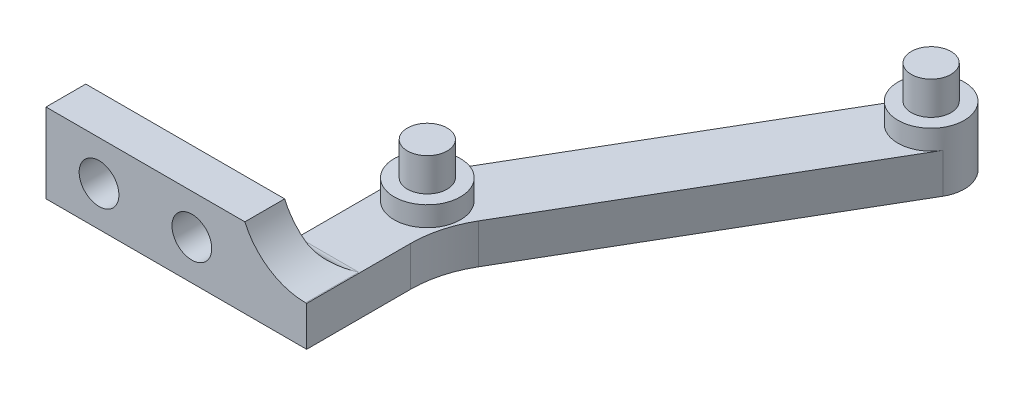
ISO-10303-21;
HEADER;
FILE_DESCRIPTION(('STEP AP214'),'2;1');
FILE_NAME('part.step','',(''),(''),'','','');
FILE_SCHEMA(('AUTOMOTIVE_DESIGN { 1 0 10303 214 1 1 1 1 }'));
ENDSEC;
DATA;
#1=APPLICATION_CONTEXT('core data for automotive mechanical design processes');
#2=APPLICATION_PROTOCOL_DEFINITION('international standard','automotive_design',2000,#1);
#3=PRODUCT_CONTEXT('',#1,'mechanical');
#4=PRODUCT('Part','Part','',(#3));
#5=PRODUCT_RELATED_PRODUCT_CATEGORY('part','',(#4));
#6=PRODUCT_DEFINITION_FORMATION('','',#4);
#7=PRODUCT_DEFINITION_CONTEXT('part definition',#1,'design');
#8=PRODUCT_DEFINITION('design','',#6,#7);
#9=PRODUCT_DEFINITION_SHAPE('','',#8);
#10=(LENGTH_UNIT() NAMED_UNIT(*) SI_UNIT(.MILLI.,.METRE.));
#11=(NAMED_UNIT(*) PLANE_ANGLE_UNIT() SI_UNIT($,.RADIAN.));
#12=(NAMED_UNIT(*) SI_UNIT($,.STERADIAN.) SOLID_ANGLE_UNIT());
#13=UNCERTAINTY_MEASURE_WITH_UNIT(LENGTH_MEASURE(1.E-05),#10,'distance_accuracy_value','');
#14=(GEOMETRIC_REPRESENTATION_CONTEXT(3) GLOBAL_UNCERTAINTY_ASSIGNED_CONTEXT((#13)) GLOBAL_UNIT_ASSIGNED_CONTEXT((#10,
#11,#12)) REPRESENTATION_CONTEXT('',''));
#15=CARTESIAN_POINT('',(0.,0.,0.));
#16=DIRECTION('',(0.,0.,1.));
#17=DIRECTION('',(1.,0.,0.));
#18=AXIS2_PLACEMENT_3D('',#15,#16,#17);
#19=CARTESIAN_POINT('',(-2.5,3.,0.));
#20=DIRECTION('',(1.,0.,0.));
#21=DIRECTION('',(0.,0.,-1.));
#22=AXIS2_PLACEMENT_3D('',#19,#20,#21);
#23=PLANE('',#22);
#24=DIRECTION('',(0.,0.,1.));
#25=VECTOR('',#24,1.);
#26=CARTESIAN_POINT('',(-2.5,0.,0.));
#27=LINE('',#26,#25);
#28=CARTESIAN_POINT('',(-2.5,0.,0.));
#29=VERTEX_POINT('',#28);
#30=CARTESIAN_POINT('',(-2.5,0.,7.25967756381021));
#31=VERTEX_POINT('',#30);
#32=EDGE_CURVE('E202',#29,#31,#27,.T.);
#33=ORIENTED_EDGE('',*,*,#32,.T.);
#34=DIRECTION('',(0.,-1.,0.));
#35=VECTOR('',#34,1.);
#36=CARTESIAN_POINT('',(-2.5,3.,7.25967756381021));
#37=LINE('',#36,#35);
#38=CARTESIAN_POINT('',(-2.5,3.,7.25967756381021));
#39=VERTEX_POINT('',#38);
#40=EDGE_CURVE('E271',#31,#39,#37,.F.);
#41=ORIENTED_EDGE('',*,*,#40,.T.);
#42=DIRECTION('',(0.,0.,1.));
#43=VECTOR('',#42,1.);
#44=CARTESIAN_POINT('',(-2.5,3.,0.));
#45=LINE('',#44,#43);
#46=CARTESIAN_POINT('',(-2.5,3.,0.));
#47=VERTEX_POINT('',#46);
#48=EDGE_CURVE('E204',#47,#39,#45,.T.);
#49=ORIENTED_EDGE('',*,*,#48,.F.);
#50=DIRECTION('',(0.,-1.,0.));
#51=VECTOR('',#50,1.);
#52=CARTESIAN_POINT('',(-2.5,3.,0.));
#53=LINE('',#52,#51);
#54=EDGE_CURVE('E215',#47,#29,#53,.T.);
#55=ORIENTED_EDGE('',*,*,#54,.T.);
#56=EDGE_LOOP('',(#33,#41,#49,#55));
#57=FACE_BOUND('',#56,.T.);
#58=ADVANCED_FACE('F57',(#57),#23,.F.);
#59=CARTESIAN_POINT('',(0.,4.5,0.));
#60=DIRECTION('',(0.,-1.,0.));
#61=DIRECTION('',(0.,0.,-1.));
#62=AXIS2_PLACEMENT_3D('',#59,#60,#61);
#63=CYLINDRICAL_SURFACE('',#62,2.5);
#64=CARTESIAN_POINT('',(0.,4.5,0.));
#65=DIRECTION('',(0.,1.,0.));
#66=DIRECTION('',(0.,0.,1.));
#67=AXIS2_PLACEMENT_3D('',#64,#65,#66);
#68=CIRCLE('',#67,2.5);
#69=CARTESIAN_POINT('',(0.,4.5,2.5));
#70=VERTEX_POINT('',#69);
#71=EDGE_CURVE('E230',#70,#70,#68,.T.);
#72=ORIENTED_EDGE('',*,*,#71,.F.);
#73=EDGE_LOOP('',(#72));
#74=FACE_BOUND('',#73,.T.);
#75=ORIENTED_EDGE('',*,*,#54,.F.);
#76=CARTESIAN_POINT('',(0.,3.,0.));
#77=DIRECTION('',(0.,1.,0.));
#78=DIRECTION('',(0.,0.,1.));
#79=AXIS2_PLACEMENT_3D('',#76,#77,#78);
#80=CIRCLE('',#79,2.5);
#81=CARTESIAN_POINT('',(2.15944725224608,3.,1.25967756381022));
#82=VERTEX_POINT('',#81);
#83=EDGE_CURVE('E213',#47,#82,#80,.T.);
#84=ORIENTED_EDGE('',*,*,#83,.T.);
#85=CARTESIAN_POINT('',(0.,3.,0.));
#86=DIRECTION('',(0.,1.,0.));
#87=DIRECTION('',(0.,0.,1.));
#88=AXIS2_PLACEMENT_3D('',#85,#86,#87);
#89=CIRCLE('',#88,2.5);
#90=CARTESIAN_POINT('',(-2.15944725224608,3.,-1.25967756381022));
#91=VERTEX_POINT('',#90);
#92=EDGE_CURVE('E242',#82,#91,#89,.T.);
#93=ORIENTED_EDGE('',*,*,#92,.T.);
#94=DIRECTION('',(0.,-1.,0.));
#95=VECTOR('',#94,1.);
#96=CARTESIAN_POINT('',(-2.15944725224608,3.,-1.25967756381022));
#97=LINE('',#96,#95);
#98=CARTESIAN_POINT('',(-2.15944725224608,0.,-1.25967756381022));
#99=VERTEX_POINT('',#98);
#100=EDGE_CURVE('E251',#91,#99,#97,.T.);
#101=ORIENTED_EDGE('',*,*,#100,.T.);
#102=CARTESIAN_POINT('',(0.,0.,0.));
#103=DIRECTION('',(0.,1.,0.));
#104=DIRECTION('',(0.,0.,1.));
#105=AXIS2_PLACEMENT_3D('',#102,#103,#104);
#106=CIRCLE('',#105,2.5);
#107=EDGE_CURVE('E226',#99,#29,#106,.T.);
#108=ORIENTED_EDGE('',*,*,#107,.T.);
#109=EDGE_LOOP('',(#75,#84,#93,#101,#108));
#110=FACE_BOUND('',#109,.T.);
#111=ADVANCED_FACE('F295',(#74,#110),#63,.T.);
#112=CARTESIAN_POINT('',(-2.15944725224608,3.,-1.25967756381022));
#113=DIRECTION('',(-0.863778900898433,0.,-0.503871025524086));
#114=DIRECTION('',(-0.503871025524086,0.,0.863778900898434));
#115=AXIS2_PLACEMENT_3D('',#112,#113,#114);
#116=PLANE('',#115);
#117=DIRECTION('',(0.503871025524086,0.,-0.863778900898434));
#118=VECTOR('',#117,1.);
#119=CARTESIAN_POINT('',(-2.15944725224608,0.,-1.25967756381022));
#120=LINE('',#119,#118);
#121=CARTESIAN_POINT('',(11.8405527477539,0.,-25.2596775638102));
#122=VERTEX_POINT('',#121);
#123=EDGE_CURVE('E233',#99,#122,#120,.T.);
#124=ORIENTED_EDGE('',*,*,#123,.F.);
#125=ORIENTED_EDGE('',*,*,#100,.F.);
#126=DIRECTION('',(0.503871025524086,0.,-0.863778900898434));
#127=VECTOR('',#126,1.);
#128=CARTESIAN_POINT('',(-2.15944725224608,3.,-1.25967756381022));
#129=LINE('',#128,#127);
#130=CARTESIAN_POINT('',(11.8405527477539,3.,-25.2596775638102));
#131=VERTEX_POINT('',#130);
#132=EDGE_CURVE('E238',#91,#131,#129,.T.);
#133=ORIENTED_EDGE('',*,*,#132,.T.);
#134=DIRECTION('',(0.,-1.,0.));
#135=VECTOR('',#134,1.);
#136=CARTESIAN_POINT('',(11.8405527477539,3.,-25.2596775638102));
#137=LINE('',#136,#135);
#138=EDGE_CURVE('E254',#131,#122,#137,.T.);
#139=ORIENTED_EDGE('',*,*,#138,.T.);
#140=EDGE_LOOP('',(#124,#125,#133,#139));
#141=FACE_BOUND('',#140,.T.);
#142=ADVANCED_FACE('F291',(#141),#116,.T.);
#143=CARTESIAN_POINT('',(2.15944725224608,3.,1.25967756381022));
#144=DIRECTION('',(-0.863778900898433,0.,-0.503871025524086));
#145=DIRECTION('',(-0.503871025524086,0.,0.863778900898433));
#146=AXIS2_PLACEMENT_3D('',#143,#144,#145);
#147=PLANE('',#146);
#148=DIRECTION('',(0.503871025524086,0.,-0.863778900898433));
#149=VECTOR('',#148,1.);
#150=CARTESIAN_POINT('',(2.15944725224608,3.,1.25967756381022));
#151=LINE('',#150,#149);
#152=CARTESIAN_POINT('',(3.24921604505862,3.,-0.6084975095827));
#153=VERTEX_POINT('',#152);
#154=CARTESIAN_POINT('',(16.1594472522461,3.,-22.7403224361898));
#155=VERTEX_POINT('',#154);
#156=EDGE_CURVE('E72',#153,#155,#151,.T.);
#157=ORIENTED_EDGE('',*,*,#156,.F.);
#158=DIRECTION('',(0.,-1.,0.));
#159=VECTOR('',#158,1.);
#160=CARTESIAN_POINT('',(3.24921604505862,3.,-0.6084975095827));
#161=LINE('',#160,#159);
#162=CARTESIAN_POINT('',(3.24921604505862,0.,-0.6084975095827));
#163=VERTEX_POINT('',#162);
#164=EDGE_CURVE('E392',#153,#163,#161,.T.);
#165=ORIENTED_EDGE('',*,*,#164,.T.);
#166=DIRECTION('',(0.503871025524086,0.,-0.863778900898433));
#167=VECTOR('',#166,1.);
#168=CARTESIAN_POINT('',(2.15944725224608,0.,1.25967756381022));
#169=LINE('',#168,#167);
#170=CARTESIAN_POINT('',(16.1594472522461,0.,-22.7403224361898));
#171=VERTEX_POINT('',#170);
#172=EDGE_CURVE('E239',#163,#171,#169,.T.);
#173=ORIENTED_EDGE('',*,*,#172,.T.);
#174=DIRECTION('',(0.,-1.,0.));
#175=VECTOR('',#174,1.);
#176=CARTESIAN_POINT('',(16.1594472522461,3.,-22.7403224361898));
#177=LINE('',#176,#175);
#178=EDGE_CURVE('E245',#155,#171,#177,.T.);
#179=ORIENTED_EDGE('',*,*,#178,.F.);
#180=EDGE_LOOP('',(#157,#165,#173,#179));
#181=FACE_BOUND('',#180,.T.);
#182=ADVANCED_FACE('F294',(#181),#147,.F.);
#183=CARTESIAN_POINT('',(0.,0.,0.));
#184=DIRECTION('',(0.,1.,0.));
#185=DIRECTION('',(0.,0.,1.));
#186=AXIS2_PLACEMENT_3D('',#183,#184,#185);
#187=PLANE('',#186);
#188=ORIENTED_EDGE('',*,*,#123,.T.);
#189=CARTESIAN_POINT('',(14.,0.,-24.));
#190=DIRECTION('',(0.,1.,0.));
#191=DIRECTION('',(0.,0.,1.));
#192=AXIS2_PLACEMENT_3D('',#189,#190,#191);
#193=CIRCLE('',#192,2.5);
#194=EDGE_CURVE('E195',#171,#122,#193,.T.);
#195=ORIENTED_EDGE('',*,*,#194,.F.);
#196=ORIENTED_EDGE('',*,*,#172,.F.);
#197=CARTESIAN_POINT('',(10.1594472522461,0.,3.42247069460999));
#198=DIRECTION('',(0.,1.,0.));
#199=DIRECTION('',(0.,0.,1.));
#200=AXIS2_PLACEMENT_3D('',#197,#198,#199);
#201=CIRCLE('',#200,8.);
#202=CARTESIAN_POINT('',(2.15944725224608,0.,3.42247069460999));
#203=VERTEX_POINT('',#202);
#204=EDGE_CURVE('E65',#163,#203,#201,.T.);
#205=ORIENTED_EDGE('',*,*,#204,.T.);
#206=DIRECTION('',(0.,0.,1.));
#207=VECTOR('',#206,1.);
#208=CARTESIAN_POINT('',(2.15944725224608,0.,0.));
#209=LINE('',#208,#207);
#210=CARTESIAN_POINT('',(2.15944725224608,0.,11.2596775638102));
#211=VERTEX_POINT('',#210);
#212=EDGE_CURVE('E208',#203,#211,#209,.T.);
#213=ORIENTED_EDGE('',*,*,#212,.T.);
#214=DIRECTION('',(1.,0.,0.));
#215=VECTOR('',#214,1.);
#216=CARTESIAN_POINT('',(0.,0.,11.2596775638102));
#217=LINE('',#216,#215);
#218=CARTESIAN_POINT('',(-17.5,0.,11.2596775638102));
#219=VERTEX_POINT('',#218);
#220=EDGE_CURVE('E218',#219,#211,#217,.T.);
#221=ORIENTED_EDGE('',*,*,#220,.F.);
#222=DIRECTION('',(0.,0.,1.));
#223=VECTOR('',#222,1.);
#224=CARTESIAN_POINT('',(-17.5,0.,11.2596775638102));
#225=LINE('',#224,#223);
#226=CARTESIAN_POINT('',(-17.5,0.,8.25967756381022));
#227=VERTEX_POINT('',#226);
#228=EDGE_CURVE('E176',#227,#219,#225,.T.);
#229=ORIENTED_EDGE('',*,*,#228,.F.);
#230=DIRECTION('',(1.,0.,0.));
#231=VECTOR('',#230,1.);
#232=CARTESIAN_POINT('',(-17.5,0.,8.25967756381022));
#233=LINE('',#232,#231);
#234=CARTESIAN_POINT('',(-3.5,0.,8.25967756381021));
#235=VERTEX_POINT('',#234);
#236=EDGE_CURVE('E189',#227,#235,#233,.T.);
#237=ORIENTED_EDGE('',*,*,#236,.T.);
#238=CARTESIAN_POINT('',(-3.5,0.,7.25967756381021));
#239=DIRECTION('',(0.,1.,0.));
#240=DIRECTION('',(0.,0.,1.));
#241=AXIS2_PLACEMENT_3D('',#238,#239,#240);
#242=CIRCLE('',#241,1.);
#243=EDGE_CURVE('E280',#235,#31,#242,.T.);
#244=ORIENTED_EDGE('',*,*,#243,.T.);
#245=ORIENTED_EDGE('',*,*,#32,.F.);
#246=ORIENTED_EDGE('',*,*,#107,.F.);
#247=EDGE_LOOP('',(#188,#195,#196,#205,#213,#221,#229,#237,#244,#245,#246));
#248=FACE_BOUND('',#247,.T.);
#249=ADVANCED_FACE('F299',(#248),#187,.F.);
#250=CARTESIAN_POINT('',(0.,4.5,0.));
#251=DIRECTION('',(0.,1.,0.));
#252=DIRECTION('',(0.,0.,1.));
#253=AXIS2_PLACEMENT_3D('',#250,#251,#252);
#254=PLANE('',#253);
#255=CARTESIAN_POINT('',(0.,4.5,0.));
#256=DIRECTION('',(0.,1.,0.));
#257=DIRECTION('',(0.,0.,1.));
#258=AXIS2_PLACEMENT_3D('',#255,#256,#257);
#259=CIRCLE('',#258,1.5);
#260=CARTESIAN_POINT('',(0.,4.5,1.5));
#261=VERTEX_POINT('',#260);
#262=EDGE_CURVE('E227',#261,#261,#259,.T.);
#263=ORIENTED_EDGE('',*,*,#262,.F.);
#264=EDGE_LOOP('',(#263));
#265=FACE_BOUND('',#264,.T.);
#266=ORIENTED_EDGE('',*,*,#71,.T.);
#267=EDGE_LOOP('',(#266));
#268=FACE_BOUND('',#267,.T.);
#269=ADVANCED_FACE('F302',(#265,#268),#254,.T.);
#270=CARTESIAN_POINT('',(0.,3.,11.2596775638102));
#271=DIRECTION('',(0.,0.,-1.));
#272=DIRECTION('',(-1.,0.,0.));
#273=AXIS2_PLACEMENT_3D('',#270,#271,#272);
#274=PLANE('',#273);
#275=CARTESIAN_POINT('',(-13.5,3.,11.2596775638102));
#276=DIRECTION('',(0.,0.,-1.));
#277=DIRECTION('',(-1.,0.,0.));
#278=AXIS2_PLACEMENT_3D('',#275,#276,#277);
#279=CIRCLE('',#278,1.5);
#280=CARTESIAN_POINT('',(-15.,3.,11.2596775638102));
#281=VERTEX_POINT('',#280);
#282=EDGE_CURVE('E369',#281,#281,#279,.T.);
#283=ORIENTED_EDGE('',*,*,#282,.T.);
#284=EDGE_LOOP('',(#283));
#285=FACE_BOUND('',#284,.T.);
#286=CARTESIAN_POINT('',(-6.5,3.,11.2596775638102));
#287=DIRECTION('',(0.,0.,-1.));
#288=DIRECTION('',(-1.,0.,0.));
#289=AXIS2_PLACEMENT_3D('',#286,#287,#288);
#290=CIRCLE('',#289,1.5);
#291=CARTESIAN_POINT('',(-8.,3.,11.2596775638102));
#292=VERTEX_POINT('',#291);
#293=EDGE_CURVE('E373',#292,#292,#290,.T.);
#294=ORIENTED_EDGE('',*,*,#293,.T.);
#295=EDGE_LOOP('',(#294));
#296=FACE_BOUND('',#295,.T.);
#297=ORIENTED_EDGE('',*,*,#220,.T.);
#298=DIRECTION('',(0.,-1.,0.));
#299=VECTOR('',#298,1.);
#300=CARTESIAN_POINT('',(2.15944725224608,3.,11.2596775638102));
#301=LINE('',#300,#299);
#302=CARTESIAN_POINT('',(2.15944725224608,3.,11.2596775638102));
#303=VERTEX_POINT('',#302);
#304=EDGE_CURVE('E223',#303,#211,#301,.T.);
#305=ORIENTED_EDGE('',*,*,#304,.F.);
#306=DIRECTION('',(1.,0.,0.));
#307=VECTOR('',#306,1.);
#308=CARTESIAN_POINT('',(0.,3.,11.2596775638102));
#309=LINE('',#308,#307);
#310=CARTESIAN_POINT('',(2.08257569495584,3.,11.2596775638102));
#311=VERTEX_POINT('',#310);
#312=EDGE_CURVE('E207',#311,#303,#309,.T.);
#313=ORIENTED_EDGE('',*,*,#312,.F.);
#314=CARTESIAN_POINT('',(2.08257569495584,8.,11.2596775638102));
#315=DIRECTION('',(0.,0.,-1.));
#316=DIRECTION('',(-1.,0.,0.));
#317=AXIS2_PLACEMENT_3D('',#314,#315,#316);
#318=CIRCLE('',#317,5.);
#319=CARTESIAN_POINT('',(-2.5,6.,11.2596775638102));
#320=VERTEX_POINT('',#319);
#321=EDGE_CURVE('E183',#311,#320,#318,.T.);
#322=ORIENTED_EDGE('',*,*,#321,.T.);
#323=DIRECTION('',(1.,0.,0.));
#324=VECTOR('',#323,1.);
#325=CARTESIAN_POINT('',(-17.5,6.,11.2596775638102));
#326=LINE('',#325,#324);
#327=CARTESIAN_POINT('',(-17.5,6.,11.2596775638102));
#328=VERTEX_POINT('',#327);
#329=EDGE_CURVE('E163',#328,#320,#326,.T.);
#330=ORIENTED_EDGE('',*,*,#329,.F.);
#331=DIRECTION('',(0.,1.,0.));
#332=VECTOR('',#331,1.);
#333=CARTESIAN_POINT('',(-17.5,0.,11.2596775638102));
#334=LINE('',#333,#332);
#335=EDGE_CURVE('E170',#219,#328,#334,.T.);
#336=ORIENTED_EDGE('',*,*,#335,.F.);
#337=EDGE_LOOP('',(#297,#305,#313,#322,#330,#336));
#338=FACE_BOUND('',#337,.T.);
#339=ADVANCED_FACE('F181',(#285,#296,#338),#274,.F.);
#340=CARTESIAN_POINT('',(2.15944725224608,3.,0.));
#341=DIRECTION('',(1.,0.,0.));
#342=DIRECTION('',(0.,0.,-1.));
#343=AXIS2_PLACEMENT_3D('',#340,#341,#342);
#344=PLANE('',#343);
#345=ORIENTED_EDGE('',*,*,#212,.F.);
#346=DIRECTION('',(0.,-1.,0.));
#347=VECTOR('',#346,1.);
#348=CARTESIAN_POINT('',(2.15944725224608,3.,3.42247069460999));
#349=LINE('',#348,#347);
#350=CARTESIAN_POINT('',(2.15944725224608,3.,3.42247069460999));
#351=VERTEX_POINT('',#350);
#352=EDGE_CURVE('E79',#203,#351,#349,.F.);
#353=ORIENTED_EDGE('',*,*,#352,.T.);
#354=DIRECTION('',(0.,0.,1.));
#355=VECTOR('',#354,1.);
#356=CARTESIAN_POINT('',(2.15944725224608,3.,0.));
#357=LINE('',#356,#355);
#358=EDGE_CURVE('E211',#351,#303,#357,.T.);
#359=ORIENTED_EDGE('',*,*,#358,.T.);
#360=ORIENTED_EDGE('',*,*,#304,.T.);
#361=EDGE_LOOP('',(#345,#353,#359,#360));
#362=FACE_BOUND('',#361,.T.);
#363=ADVANCED_FACE('F315',(#362),#344,.T.);
#364=CARTESIAN_POINT('',(0.,3.,0.));
#365=DIRECTION('',(0.,1.,0.));
#366=DIRECTION('',(0.,0.,1.));
#367=AXIS2_PLACEMENT_3D('',#364,#365,#366);
#368=PLANE('',#367);
#369=ORIENTED_EDGE('',*,*,#48,.T.);
#370=DIRECTION('',(1.,0.,0.));
#371=VECTOR('',#370,1.);
#372=CARTESIAN_POINT('',(0.,3.,7.25967756381021));
#373=LINE('',#372,#371);
#374=CARTESIAN_POINT('',(2.08257569495584,3.,7.25967756381021));
#375=VERTEX_POINT('',#374);
#376=EDGE_CURVE('E264',#39,#375,#373,.T.);
#377=ORIENTED_EDGE('',*,*,#376,.T.);
#378=DIRECTION('',(0.,0.,-1.));
#379=VECTOR('',#378,1.);
#380=CARTESIAN_POINT('',(2.08257569495584,3.,11.2596775638102));
#381=LINE('',#380,#379);
#382=EDGE_CURVE('E257',#375,#311,#381,.F.);
#383=ORIENTED_EDGE('',*,*,#382,.T.);
#384=ORIENTED_EDGE('',*,*,#312,.T.);
#385=ORIENTED_EDGE('',*,*,#358,.F.);
#386=CARTESIAN_POINT('',(10.1594472522461,3.,3.42247069460999));
#387=DIRECTION('',(0.,1.,0.));
#388=DIRECTION('',(0.,0.,1.));
#389=AXIS2_PLACEMENT_3D('',#386,#387,#388);
#390=CIRCLE('',#389,8.);
#391=EDGE_CURVE('E12',#351,#153,#390,.F.);
#392=ORIENTED_EDGE('',*,*,#391,.T.);
#393=ORIENTED_EDGE('',*,*,#156,.T.);
#394=CARTESIAN_POINT('',(14.,3.,-24.));
#395=DIRECTION('',(0.,1.,0.));
#396=DIRECTION('',(0.,0.,1.));
#397=AXIS2_PLACEMENT_3D('',#394,#395,#396);
#398=CIRCLE('',#397,2.5);
#399=EDGE_CURVE('E235',#131,#155,#398,.T.);
#400=ORIENTED_EDGE('',*,*,#399,.F.);
#401=ORIENTED_EDGE('',*,*,#132,.F.);
#402=ORIENTED_EDGE('',*,*,#92,.F.);
#403=ORIENTED_EDGE('',*,*,#83,.F.);
#404=EDGE_LOOP('',(#369,#377,#383,#384,#385,#392,#393,#400,#401,#402,#403));
#405=FACE_BOUND('',#404,.T.);
#406=ADVANCED_FACE('F319',(#405),#368,.T.);
#407=CARTESIAN_POINT('',(14.,4.5,-24.));
#408=DIRECTION('',(0.,-1.,0.));
#409=DIRECTION('',(0.,0.,-1.));
#410=AXIS2_PLACEMENT_3D('',#407,#408,#409);
#411=CYLINDRICAL_SURFACE('',#410,2.5);
#412=CARTESIAN_POINT('',(14.,4.5,-24.));
#413=DIRECTION('',(0.,1.,0.));
#414=DIRECTION('',(0.,0.,1.));
#415=AXIS2_PLACEMENT_3D('',#412,#413,#414);
#416=CIRCLE('',#415,2.5);
#417=CARTESIAN_POINT('',(14.,4.5,-21.5));
#418=VERTEX_POINT('',#417);
#419=EDGE_CURVE('E199',#418,#418,#416,.T.);
#420=ORIENTED_EDGE('',*,*,#419,.F.);
#421=EDGE_LOOP('',(#420));
#422=FACE_BOUND('',#421,.T.);
#423=ORIENTED_EDGE('',*,*,#194,.T.);
#424=ORIENTED_EDGE('',*,*,#138,.F.);
#425=ORIENTED_EDGE('',*,*,#399,.T.);
#426=ORIENTED_EDGE('',*,*,#178,.T.);
#427=EDGE_LOOP('',(#423,#424,#425,#426));
#428=FACE_BOUND('',#427,.T.);
#429=ADVANCED_FACE('F322',(#422,#428),#411,.T.);
#430=CARTESIAN_POINT('',(0.,4.5,0.));
#431=DIRECTION('',(0.,1.,0.));
#432=DIRECTION('',(0.,0.,1.));
#433=AXIS2_PLACEMENT_3D('',#430,#431,#432);
#434=PLANE('',#433);
#435=CARTESIAN_POINT('',(14.,4.5,-24.));
#436=DIRECTION('',(0.,1.,0.));
#437=DIRECTION('',(0.,0.,1.));
#438=AXIS2_PLACEMENT_3D('',#435,#436,#437);
#439=CIRCLE('',#438,1.5);
#440=CARTESIAN_POINT('',(14.,4.5,-22.5));
#441=VERTEX_POINT('',#440);
#442=EDGE_CURVE('E196',#441,#441,#439,.T.);
#443=ORIENTED_EDGE('',*,*,#442,.F.);
#444=EDGE_LOOP('',(#443));
#445=FACE_BOUND('',#444,.T.);
#446=ORIENTED_EDGE('',*,*,#419,.T.);
#447=EDGE_LOOP('',(#446));
#448=FACE_BOUND('',#447,.T.);
#449=ADVANCED_FACE('F326',(#445,#448),#434,.T.);
#450=CARTESIAN_POINT('',(0.,7.,0.));
#451=DIRECTION('',(0.,1.,0.));
#452=DIRECTION('',(0.,0.,1.));
#453=AXIS2_PLACEMENT_3D('',#450,#451,#452);
#454=PLANE('',#453);
#455=CARTESIAN_POINT('',(0.,7.,0.));
#456=DIRECTION('',(0.,1.,0.));
#457=DIRECTION('',(0.,0.,1.));
#458=AXIS2_PLACEMENT_3D('',#455,#456,#457);
#459=CIRCLE('',#458,1.5);
#460=CARTESIAN_POINT('',(0.,7.,1.5));
#461=VERTEX_POINT('',#460);
#462=EDGE_CURVE('E187',#461,#461,#459,.T.);
#463=ORIENTED_EDGE('',*,*,#462,.T.);
#464=EDGE_LOOP('',(#463));
#465=FACE_BOUND('',#464,.T.);
#466=ADVANCED_FACE('F330',(#465),#454,.T.);
#467=CARTESIAN_POINT('',(0.,7.,0.));
#468=DIRECTION('',(0.,-1.,0.));
#469=DIRECTION('',(0.,0.,-1.));
#470=AXIS2_PLACEMENT_3D('',#467,#468,#469);
#471=CYLINDRICAL_SURFACE('',#470,1.5);
#472=ORIENTED_EDGE('',*,*,#262,.T.);
#473=EDGE_LOOP('',(#472));
#474=FACE_BOUND('',#473,.T.);
#475=ORIENTED_EDGE('',*,*,#462,.F.);
#476=EDGE_LOOP('',(#475));
#477=FACE_BOUND('',#476,.T.);
#478=ADVANCED_FACE('F332',(#474,#477),#471,.T.);
#479=CARTESIAN_POINT('',(0.,7.,0.));
#480=DIRECTION('',(0.,1.,0.));
#481=DIRECTION('',(0.,0.,1.));
#482=AXIS2_PLACEMENT_3D('',#479,#480,#481);
#483=PLANE('',#482);
#484=CARTESIAN_POINT('',(14.,7.,-24.));
#485=DIRECTION('',(0.,1.,0.));
#486=DIRECTION('',(0.,0.,1.));
#487=AXIS2_PLACEMENT_3D('',#484,#485,#486);
#488=CIRCLE('',#487,1.5);
#489=CARTESIAN_POINT('',(14.,7.,-22.5));
#490=VERTEX_POINT('',#489);
#491=EDGE_CURVE('E184',#490,#490,#488,.T.);
#492=ORIENTED_EDGE('',*,*,#491,.T.);
#493=EDGE_LOOP('',(#492));
#494=FACE_BOUND('',#493,.T.);
#495=ADVANCED_FACE('F335',(#494),#483,.T.);
#496=CARTESIAN_POINT('',(14.,7.,-24.));
#497=DIRECTION('',(0.,-1.,0.));
#498=DIRECTION('',(0.,0.,-1.));
#499=AXIS2_PLACEMENT_3D('',#496,#497,#498);
#500=CYLINDRICAL_SURFACE('',#499,1.5);
#501=ORIENTED_EDGE('',*,*,#442,.T.);
#502=EDGE_LOOP('',(#501));
#503=FACE_BOUND('',#502,.T.);
#504=ORIENTED_EDGE('',*,*,#491,.F.);
#505=EDGE_LOOP('',(#504));
#506=FACE_BOUND('',#505,.T.);
#507=ADVANCED_FACE('F340',(#503,#506),#500,.T.);
#508=CARTESIAN_POINT('',(-17.5,6.,11.2596775638102));
#509=DIRECTION('',(0.,-1.,0.));
#510=DIRECTION('',(0.,0.,-1.));
#511=AXIS2_PLACEMENT_3D('',#508,#509,#510);
#512=PLANE('',#511);
#513=DIRECTION('',(0.,0.,-1.));
#514=VECTOR('',#513,1.);
#515=CARTESIAN_POINT('',(-2.5,6.,11.2596775638102));
#516=LINE('',#515,#514);
#517=CARTESIAN_POINT('',(-2.5,6.,8.25967756381021));
#518=VERTEX_POINT('',#517);
#519=EDGE_CURVE('E179',#320,#518,#516,.T.);
#520=ORIENTED_EDGE('',*,*,#519,.T.);
#521=DIRECTION('',(1.,0.,0.));
#522=VECTOR('',#521,1.);
#523=CARTESIAN_POINT('',(-17.5,6.,8.25967756381022));
#524=LINE('',#523,#522);
#525=CARTESIAN_POINT('',(-17.5,6.,8.25967756381022));
#526=VERTEX_POINT('',#525);
#527=EDGE_CURVE('E166',#526,#518,#524,.T.);
#528=ORIENTED_EDGE('',*,*,#527,.F.);
#529=DIRECTION('',(0.,0.,-1.));
#530=VECTOR('',#529,1.);
#531=CARTESIAN_POINT('',(-17.5,6.,11.2596775638102));
#532=LINE('',#531,#530);
#533=EDGE_CURVE('E159',#328,#526,#532,.T.);
#534=ORIENTED_EDGE('',*,*,#533,.F.);
#535=ORIENTED_EDGE('',*,*,#329,.T.);
#536=EDGE_LOOP('',(#520,#528,#534,#535));
#537=FACE_BOUND('',#536,.T.);
#538=ADVANCED_FACE('F161',(#537),#512,.F.);
#539=CARTESIAN_POINT('',(-17.5,0.,8.25967756381022));
#540=DIRECTION('',(0.,0.,1.));
#541=DIRECTION('',(1.,0.,0.));
#542=AXIS2_PLACEMENT_3D('',#539,#540,#541);
#543=PLANE('',#542);
#544=CARTESIAN_POINT('',(-13.5,3.,8.25967756381022));
#545=DIRECTION('',(0.,0.,-1.));
#546=DIRECTION('',(-1.,0.,0.));
#547=AXIS2_PLACEMENT_3D('',#544,#545,#546);
#548=CIRCLE('',#547,1.5);
#549=CARTESIAN_POINT('',(-15.,3.,8.25967756381022));
#550=VERTEX_POINT('',#549);
#551=EDGE_CURVE('E366',#550,#550,#548,.T.);
#552=ORIENTED_EDGE('',*,*,#551,.F.);
#553=EDGE_LOOP('',(#552));
#554=FACE_BOUND('',#553,.T.);
#555=CARTESIAN_POINT('',(-6.5,3.,8.25967756381021));
#556=DIRECTION('',(0.,0.,-1.));
#557=DIRECTION('',(-1.,0.,0.));
#558=AXIS2_PLACEMENT_3D('',#555,#556,#557);
#559=CIRCLE('',#558,1.5);
#560=CARTESIAN_POINT('',(-8.,3.,8.25967756381021));
#561=VERTEX_POINT('',#560);
#562=EDGE_CURVE('E370',#561,#561,#559,.T.);
#563=ORIENTED_EDGE('',*,*,#562,.F.);
#564=EDGE_LOOP('',(#563));
#565=FACE_BOUND('',#564,.T.);
#566=CARTESIAN_POINT('',(2.08257569495584,8.,8.25967756381021));
#567=DIRECTION('',(0.,0.,1.));
#568=DIRECTION('',(1.,0.,0.));
#569=AXIS2_PLACEMENT_3D('',#566,#567,#568);
#570=CIRCLE('',#569,5.);
#571=CARTESIAN_POINT('',(-0.917424305044158,4.,8.25967756381021));
#572=VERTEX_POINT('',#571);
#573=EDGE_CURVE('E261',#518,#572,#570,.T.);
#574=ORIENTED_EDGE('',*,*,#573,.T.);
#575=DIRECTION('',(1.,0.,0.));
#576=VECTOR('',#575,1.);
#577=CARTESIAN_POINT('',(-17.5,4.,8.25967756381022));
#578=LINE('',#577,#576);
#579=CARTESIAN_POINT('',(-3.5,4.,8.25967756381021));
#580=VERTEX_POINT('',#579);
#581=EDGE_CURVE('E269',#572,#580,#578,.F.);
#582=ORIENTED_EDGE('',*,*,#581,.T.);
#583=DIRECTION('',(0.,-1.,0.));
#584=VECTOR('',#583,1.);
#585=CARTESIAN_POINT('',(-3.5,0.,8.25967756381021));
#586=LINE('',#585,#584);
#587=EDGE_CURVE('E267',#580,#235,#586,.T.);
#588=ORIENTED_EDGE('',*,*,#587,.T.);
#589=ORIENTED_EDGE('',*,*,#236,.F.);
#590=DIRECTION('',(0.,-1.,0.));
#591=VECTOR('',#590,1.);
#592=CARTESIAN_POINT('',(-17.5,0.,8.25967756381022));
#593=LINE('',#592,#591);
#594=EDGE_CURVE('E169',#526,#227,#593,.T.);
#595=ORIENTED_EDGE('',*,*,#594,.F.);
#596=ORIENTED_EDGE('',*,*,#527,.T.);
#597=EDGE_LOOP('',(#574,#582,#588,#589,#595,#596));
#598=FACE_BOUND('',#597,.T.);
#599=ADVANCED_FACE('F349',(#554,#565,#598),#543,.F.);
#600=CARTESIAN_POINT('',(-17.5,0.,0.));
#601=DIRECTION('',(-1.,0.,0.));
#602=DIRECTION('',(0.,0.,1.));
#603=AXIS2_PLACEMENT_3D('',#600,#601,#602);
#604=PLANE('',#603);
#605=ORIENTED_EDGE('',*,*,#335,.T.);
#606=ORIENTED_EDGE('',*,*,#533,.T.);
#607=ORIENTED_EDGE('',*,*,#594,.T.);
#608=ORIENTED_EDGE('',*,*,#228,.T.);
#609=EDGE_LOOP('',(#605,#606,#607,#608));
#610=FACE_BOUND('',#609,.T.);
#611=ADVANCED_FACE('F174',(#610),#604,.T.);
#612=CARTESIAN_POINT('',(-6.5,3.,28.2596775638102));
#613=DIRECTION('',(0.,0.,-1.));
#614=DIRECTION('',(-1.,0.,0.));
#615=AXIS2_PLACEMENT_3D('',#612,#613,#614);
#616=CYLINDRICAL_SURFACE('',#615,1.5);
#617=ORIENTED_EDGE('',*,*,#562,.T.);
#618=EDGE_LOOP('',(#617));
#619=FACE_BOUND('',#618,.T.);
#620=ORIENTED_EDGE('',*,*,#293,.F.);
#621=EDGE_LOOP('',(#620));
#622=FACE_BOUND('',#621,.T.);
#623=ADVANCED_FACE('F355',(#619,#622),#616,.F.);
#624=CARTESIAN_POINT('',(-13.5,3.,28.2596775638102));
#625=DIRECTION('',(0.,0.,-1.));
#626=DIRECTION('',(-1.,0.,0.));
#627=AXIS2_PLACEMENT_3D('',#624,#625,#626);
#628=CYLINDRICAL_SURFACE('',#627,1.5);
#629=ORIENTED_EDGE('',*,*,#551,.T.);
#630=EDGE_LOOP('',(#629));
#631=FACE_BOUND('',#630,.T.);
#632=ORIENTED_EDGE('',*,*,#282,.F.);
#633=EDGE_LOOP('',(#632));
#634=FACE_BOUND('',#633,.T.);
#635=ADVANCED_FACE('F289',(#631,#634),#628,.F.);
#636=CARTESIAN_POINT('',(2.08257569495584,8.,0.));
#637=DIRECTION('',(0.,0.,1.));
#638=DIRECTION('',(0.,-1.,0.));
#639=AXIS2_PLACEMENT_3D('',#636,#637,#638);
#640=CYLINDRICAL_SURFACE('',#639,5.);
#641=ORIENTED_EDGE('',*,*,#573,.F.);
#642=ORIENTED_EDGE('',*,*,#519,.F.);
#643=ORIENTED_EDGE('',*,*,#321,.F.);
#644=ORIENTED_EDGE('',*,*,#382,.F.);
#645=CARTESIAN_POINT('',(-0.917424305044158,4.,8.25967756381021));
#646=CARTESIAN_POINT('',(-0.854369000350623,3.95269543909304,8.2596404014731));
#647=CARTESIAN_POINT('',(-0.790249588251678,3.90694840116779,8.25632508269871));
#648=CARTESIAN_POINT('',(-0.660406580755662,3.81883226441313,8.2441417797787));
#649=CARTESIAN_POINT('',(-0.594686266890934,3.77645690898257,8.23528436402922));
#650=CARTESIAN_POINT('',(-0.46237201045014,3.69544093852608,8.21308819562528));
#651=CARTESIAN_POINT('',(-0.395786992372202,3.65677698529477,8.19978018204885));
#652=CARTESIAN_POINT('',(-0.261538612066119,3.58287395537808,8.16940448146839));
#653=CARTESIAN_POINT('',(-0.193874568452718,3.54763715133023,8.152334323854));
#654=CARTESIAN_POINT('',(-0.0143542279095308,3.459261147298,8.10320861723696));
#655=CARTESIAN_POINT('',(0.0982130564937451,3.40900552682415,8.06853126096345));
#656=CARTESIAN_POINT('',(0.324920157080013,3.31752155415561,7.99298686910346));
#657=CARTESIAN_POINT('',(0.439060619972852,3.2762970397442,7.95211721452106));
#658=CARTESIAN_POINT('',(0.668880814818231,3.20249150919591,7.86566610240254));
#659=CARTESIAN_POINT('',(0.784564805127783,3.1699447096147,7.82006694933036));
#660=CARTESIAN_POINT('',(1.01664775999865,3.1134821684522,7.72562960205347));
#661=CARTESIAN_POINT('',(1.1330464822144,3.08956364963487,7.67679245608313));
#662=CARTESIAN_POINT('',(1.38605188922771,3.0468208653339,7.56852399701461));
#663=CARTESIAN_POINT('',(1.52274958270582,3.02954044031088,7.50869700638436));
#664=CARTESIAN_POINT('',(1.79620273623678,3.00632651981242,7.38772764267861));
#665=CARTESIAN_POINT('',(1.9329574877224,3.00036955146973,7.32658825694592));
#666=CARTESIAN_POINT('',(2.07396910884164,3.00000555844377,7.26352654527087));
#667=CARTESIAN_POINT('',(2.07827242831441,3.00000000322476,7.26160204223635));
#668=CARTESIAN_POINT('',(2.08257569495584,3.,7.25967756381021));
#669=B_SPLINE_CURVE_WITH_KNOTS('',3,(#645,#646,#647,#648,#649,#650,#651,#652,#653,#654,#655,
#656,#657,#658,#659,#660,#661,#662,#663,#664,#665,#666,#667,#668),.UNSPECIFIED.,.F.,.F.,(4,2,2,
2,2,2,2,2,2,2,2,4),(0.,0.23627220085112,0.472095214354684,0.70632198967822,0.94070304314473,
1.32429275355713,1.70804515619819,2.09328905143215,2.47840883504633,2.92860728181178,
3.37787147131305,3.39201361675777),.UNSPECIFIED.);
#670=EDGE_CURVE('E273',#375,#572,#669,.F.);
#671=ORIENTED_EDGE('',*,*,#670,.T.);
#672=EDGE_LOOP('',(#641,#642,#643,#644,#671));
#673=FACE_BOUND('',#672,.T.);
#674=ADVANCED_FACE('F284',(#673),#640,.F.);
#675=CARTESIAN_POINT('',(-3.5,0.,7.25967756381021));
#676=DIRECTION('',(0.,1.,0.));
#677=DIRECTION('',(0.,0.,1.));
#678=AXIS2_PLACEMENT_3D('',#675,#676,#677);
#679=CYLINDRICAL_SURFACE('',#678,1.);
#680=ORIENTED_EDGE('',*,*,#243,.F.);
#681=ORIENTED_EDGE('',*,*,#587,.F.);
#682=CARTESIAN_POINT('',(-3.5,4.,7.25967756381021));
#683=DIRECTION('',(0.707106781186547,0.707106781186547,0.));
#684=DIRECTION('',(-0.707106781186547,0.707106781186547,0.));
#685=AXIS2_PLACEMENT_3D('',#682,#683,#684);
#686=ELLIPSE('',#685,1.41421356237309,1.);
#687=EDGE_CURVE('E375',#39,#580,#686,.F.);
#688=ORIENTED_EDGE('',*,*,#687,.F.);
#689=ORIENTED_EDGE('',*,*,#40,.F.);
#690=EDGE_LOOP('',(#680,#681,#688,#689));
#691=FACE_BOUND('',#690,.T.);
#692=ADVANCED_FACE('F288',(#691),#679,.F.);
#693=CARTESIAN_POINT('',(0.,4.,7.25967756381021));
#694=DIRECTION('',(1.,0.,0.));
#695=DIRECTION('',(0.,0.,-1.));
#696=AXIS2_PLACEMENT_3D('',#693,#694,#695);
#697=CYLINDRICAL_SURFACE('',#696,1.);
#698=ORIENTED_EDGE('',*,*,#687,.T.);
#699=ORIENTED_EDGE('',*,*,#581,.F.);
#700=ORIENTED_EDGE('',*,*,#670,.F.);
#701=ORIENTED_EDGE('',*,*,#376,.F.);
#702=EDGE_LOOP('',(#698,#699,#700,#701));
#703=FACE_BOUND('',#702,.T.);
#704=ADVANCED_FACE('F282',(#703),#697,.F.);
#705=CARTESIAN_POINT('',(10.1594472522461,3.,3.42247069460999));
#706=DIRECTION('',(0.,-1.,0.));
#707=DIRECTION('',(0.,0.,-1.));
#708=AXIS2_PLACEMENT_3D('',#705,#706,#707);
#709=CYLINDRICAL_SURFACE('',#708,8.);
#710=ORIENTED_EDGE('',*,*,#391,.F.);
#711=ORIENTED_EDGE('',*,*,#352,.F.);
#712=ORIENTED_EDGE('',*,*,#204,.F.);
#713=ORIENTED_EDGE('',*,*,#164,.F.);
#714=EDGE_LOOP('',(#710,#711,#712,#713));
#715=FACE_BOUND('',#714,.T.);
#716=ADVANCED_FACE('F59',(#715),#709,.F.);
#717=CLOSED_SHELL('',(#58,#111,#142,#182,#249,#269,#339,#363,#406,#429,#449,#466,#478,#495,#507,
#538,#599,#611,#623,#635,#674,#692,#704,#716));
#718=MANIFOLD_SOLID_BREP('B2',#717);
#719=ADVANCED_BREP_SHAPE_REPRESENTATION('',(#18,#718),#14);
#720=SHAPE_DEFINITION_REPRESENTATION(#9,#719);
ENDSEC;
END-ISO-10303-21;
